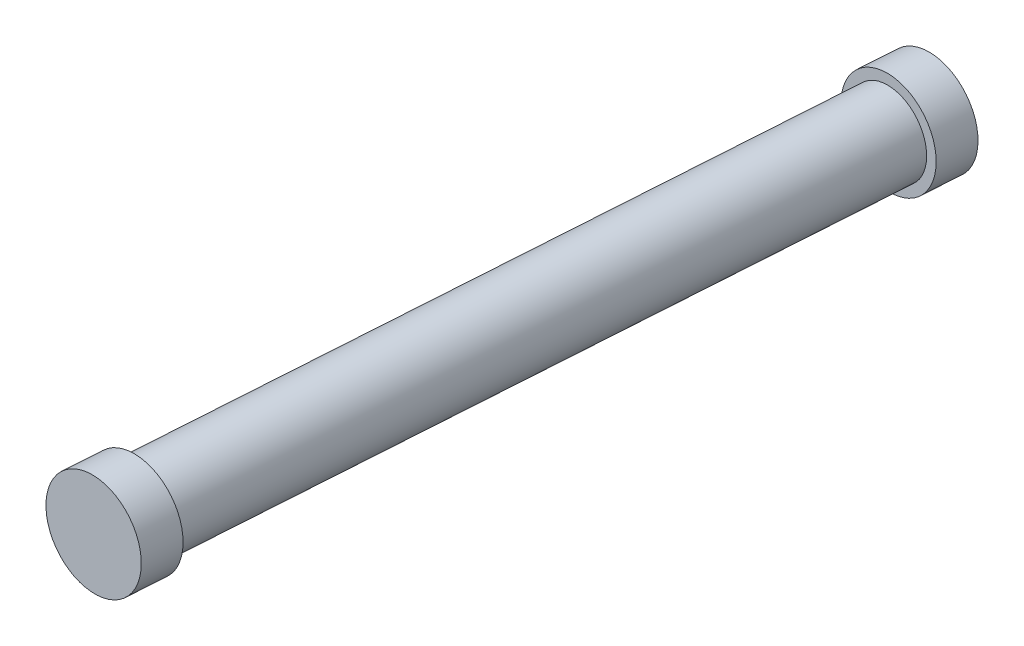
ISO-10303-21;
HEADER;
FILE_DESCRIPTION(('STEP AP214'),'2;1');
FILE_NAME('part.step','',(''),(''),'','','');
FILE_SCHEMA(('AUTOMOTIVE_DESIGN { 1 0 10303 214 1 1 1 1 }'));
ENDSEC;
DATA;
#1=APPLICATION_CONTEXT('core data for automotive mechanical design processes');
#2=APPLICATION_PROTOCOL_DEFINITION('international standard','automotive_design',2000,#1);
#3=PRODUCT_CONTEXT('',#1,'mechanical');
#4=PRODUCT('Part','Part','',(#3));
#5=PRODUCT_RELATED_PRODUCT_CATEGORY('part','',(#4));
#6=PRODUCT_DEFINITION_FORMATION('','',#4);
#7=PRODUCT_DEFINITION_CONTEXT('part definition',#1,'design');
#8=PRODUCT_DEFINITION('design','',#6,#7);
#9=PRODUCT_DEFINITION_SHAPE('','',#8);
#10=(LENGTH_UNIT() NAMED_UNIT(*) SI_UNIT(.MILLI.,.METRE.));
#11=(NAMED_UNIT(*) PLANE_ANGLE_UNIT() SI_UNIT($,.RADIAN.));
#12=(NAMED_UNIT(*) SI_UNIT($,.STERADIAN.) SOLID_ANGLE_UNIT());
#13=UNCERTAINTY_MEASURE_WITH_UNIT(LENGTH_MEASURE(1.E-05),#10,'distance_accuracy_value','');
#14=(GEOMETRIC_REPRESENTATION_CONTEXT(3) GLOBAL_UNCERTAINTY_ASSIGNED_CONTEXT((#13)) GLOBAL_UNIT_ASSIGNED_CONTEXT((#10,
#11,#12)) REPRESENTATION_CONTEXT('',''));
#15=CARTESIAN_POINT('',(0.,0.,0.));
#16=DIRECTION('',(0.,0.,1.));
#17=DIRECTION('',(1.,0.,0.));
#18=AXIS2_PLACEMENT_3D('',#15,#16,#17);
#19=CARTESIAN_POINT('',(1099.8620660427,-65.8785208277451,115.593383200574));
#20=DIRECTION('',(-0.0466405838075336,0.0185987394129378,0.998738575821692));
#21=DIRECTION('',(0.998911359031264,0.,0.0466486526955906));
#22=AXIS2_PLACEMENT_3D('',#19,#20,#21);
#23=CYLINDRICAL_SURFACE('',#22,1.00000000024766);
#24=CARTESIAN_POINT('',(1099.8620660427,-65.8785208277451,115.593383200574));
#25=DIRECTION('',(-0.0466405838075336,0.0185987394129378,0.998738575821692));
#26=DIRECTION('',(0.998911359031264,0.,0.0466486526955906));
#27=AXIS2_PLACEMENT_3D('',#24,#25,#26);
#28=CIRCLE('',#27,1.00000000024766);
#29=CARTESIAN_POINT('',(1100.86097740198,-65.8785208277451,115.640031853281));
#30=VERTEX_POINT('',#29);
#31=EDGE_CURVE('E55',#30,#30,#28,.T.);
#32=ORIENTED_EDGE('',*,*,#31,.T.);
#33=EDGE_LOOP('',(#32));
#34=FACE_BOUND('',#33,.T.);
#35=CARTESIAN_POINT('',(1099.02253553417,-65.5437435183122,133.570677565365));
#36=DIRECTION('',(-0.0466405838075336,0.0185987394129378,0.998738575821692));
#37=DIRECTION('',(0.998911359031264,0.,0.0466486526955906));
#38=AXIS2_PLACEMENT_3D('',#35,#36,#37);
#39=CIRCLE('',#38,1.00000000024766);
#40=CARTESIAN_POINT('',(1100.02144689344,-65.5437435183122,133.617326218072));
#41=VERTEX_POINT('',#40);
#42=EDGE_CURVE('E10',#41,#41,#39,.T.);
#43=ORIENTED_EDGE('',*,*,#42,.F.);
#44=EDGE_LOOP('',(#43));
#45=FACE_BOUND('',#44,.T.);
#46=ADVANCED_FACE('F37',(#34,#45),#23,.T.);
#47=CARTESIAN_POINT('',(1098.97589495036,-65.5251447788993,134.569416141186));
#48=DIRECTION('',(0.0466405838075336,-0.0185987394129379,-0.998738575821692));
#49=DIRECTION('',(-0.998911359031264,0.,-0.0466486526955907));
#50=AXIS2_PLACEMENT_3D('',#47,#48,#49);
#51=CYLINDRICAL_SURFACE('',#50,1.25000000024777);
#52=CARTESIAN_POINT('',(1098.97589495036,-65.5251447788993,134.569416141186));
#53=DIRECTION('',(-0.0466405838075336,0.0185987394129379,0.998738575821692));
#54=DIRECTION('',(0.998911359031264,0.,0.0466486526955907));
#55=AXIS2_PLACEMENT_3D('',#52,#53,#54);
#56=CIRCLE('',#55,1.25000000024777);
#57=CARTESIAN_POINT('',(1100.2245341494,-65.5251447788993,134.627726957068));
#58=VERTEX_POINT('',#57);
#59=EDGE_CURVE('E44',#58,#58,#56,.T.);
#60=ORIENTED_EDGE('',*,*,#59,.F.);
#61=EDGE_LOOP('',(#60));
#62=FACE_BOUND('',#61,.T.);
#63=CARTESIAN_POINT('',(1099.02253553417,-65.5437435183122,133.570677565365));
#64=DIRECTION('',(-0.0466405838075336,0.0185987394129379,0.998738575821692));
#65=DIRECTION('',(0.998911359031264,0.,0.0466486526955907));
#66=AXIS2_PLACEMENT_3D('',#63,#64,#65);
#67=CIRCLE('',#66,1.25000000024777);
#68=CARTESIAN_POINT('',(1100.2711747332,-65.5437435183122,133.628988381246));
#69=VERTEX_POINT('',#68);
#70=EDGE_CURVE('E49',#69,#69,#67,.T.);
#71=ORIENTED_EDGE('',*,*,#70,.T.);
#72=EDGE_LOOP('',(#71));
#73=FACE_BOUND('',#72,.T.);
#74=ADVANCED_FACE('F91',(#62,#73),#51,.T.);
#75=CARTESIAN_POINT('',(1098.97589495036,-65.5251447788993,134.569416141186));
#76=DIRECTION('',(-0.0466405838075336,0.0185987394129379,0.998738575821692));
#77=DIRECTION('',(0.998911359031264,0.,0.0466486526955907));
#78=AXIS2_PLACEMENT_3D('',#75,#76,#77);
#79=PLANE('',#78);
#80=ORIENTED_EDGE('',*,*,#59,.T.);
#81=EDGE_LOOP('',(#80));
#82=FACE_BOUND('',#81,.T.);
#83=ADVANCED_FACE('F86',(#82),#79,.T.);
#84=CARTESIAN_POINT('',(1099.02253553417,-65.5437435183122,133.570677565365));
#85=DIRECTION('',(-0.0466405838075336,0.0185987394129379,0.998738575821692));
#86=DIRECTION('',(0.998911359031264,0.,0.0466486526955907));
#87=AXIS2_PLACEMENT_3D('',#84,#85,#86);
#88=PLANE('',#87);
#89=ORIENTED_EDGE('',*,*,#42,.T.);
#90=EDGE_LOOP('',(#89));
#91=FACE_BOUND('',#90,.T.);
#92=ORIENTED_EDGE('',*,*,#70,.F.);
#93=EDGE_LOOP('',(#92));
#94=FACE_BOUND('',#93,.T.);
#95=ADVANCED_FACE('F78',(#91,#94),#88,.F.);
#96=CARTESIAN_POINT('',(1099.90870662651,-65.8971195671581,114.594644624753));
#97=DIRECTION('',(-0.0466405838075336,0.0185987394129379,0.998738575821692));
#98=DIRECTION('',(0.998911359031264,0.,0.0466486526955907));
#99=AXIS2_PLACEMENT_3D('',#96,#97,#98);
#100=CYLINDRICAL_SURFACE('',#99,1.25000000024777);
#101=CARTESIAN_POINT('',(1099.90870662651,-65.8971195671581,114.594644624753));
#102=DIRECTION('',(-0.0466405838075336,0.0185987394129378,0.998738575821692));
#103=DIRECTION('',(0.998911359031264,0.,0.0466486526955907));
#104=AXIS2_PLACEMENT_3D('',#101,#102,#103);
#105=CIRCLE('',#104,1.25000000024777);
#106=CARTESIAN_POINT('',(1101.15734582555,-65.8971195671581,114.652955440634));
#107=VERTEX_POINT('',#106);
#108=EDGE_CURVE('E62',#107,#107,#105,.T.);
#109=ORIENTED_EDGE('',*,*,#108,.T.);
#110=EDGE_LOOP('',(#109));
#111=FACE_BOUND('',#110,.T.);
#112=CARTESIAN_POINT('',(1099.8620660427,-65.8785208277451,115.593383200574));
#113=DIRECTION('',(-0.0466405838075336,0.0185987394129378,0.998738575821692));
#114=DIRECTION('',(0.998911359031264,0.,0.0466486526955907));
#115=AXIS2_PLACEMENT_3D('',#112,#113,#114);
#116=CIRCLE('',#115,1.25000000024777);
#117=CARTESIAN_POINT('',(1101.11070524174,-65.8785208277451,115.651694016455));
#118=VERTEX_POINT('',#117);
#119=EDGE_CURVE('E58',#118,#118,#116,.T.);
#120=ORIENTED_EDGE('',*,*,#119,.F.);
#121=EDGE_LOOP('',(#120));
#122=FACE_BOUND('',#121,.T.);
#123=ADVANCED_FACE('F75',(#111,#122),#100,.T.);
#124=CARTESIAN_POINT('',(1099.90870662651,-65.8971195671581,114.594644624753));
#125=DIRECTION('',(0.0466405838075336,-0.0185987394129378,-0.998738575821692));
#126=DIRECTION('',(0.998911359031264,0.,0.0466486526955907));
#127=AXIS2_PLACEMENT_3D('',#124,#125,#126);
#128=PLANE('',#127);
#129=ORIENTED_EDGE('',*,*,#108,.F.);
#130=EDGE_LOOP('',(#129));
#131=FACE_BOUND('',#130,.T.);
#132=ADVANCED_FACE('F77',(#131),#128,.T.);
#133=CARTESIAN_POINT('',(1099.8620660427,-65.8785208277451,115.593383200574));
#134=DIRECTION('',(0.0466405838075336,-0.0185987394129378,-0.998738575821692));
#135=DIRECTION('',(0.998911359031264,0.,0.0466486526955907));
#136=AXIS2_PLACEMENT_3D('',#133,#134,#135);
#137=PLANE('',#136);
#138=ORIENTED_EDGE('',*,*,#31,.F.);
#139=EDGE_LOOP('',(#138));
#140=FACE_BOUND('',#139,.T.);
#141=ORIENTED_EDGE('',*,*,#119,.T.);
#142=EDGE_LOOP('',(#141));
#143=FACE_BOUND('',#142,.T.);
#144=ADVANCED_FACE('F73',(#140,#143),#137,.F.);
#145=CLOSED_SHELL('',(#46,#74,#83,#95,#123,#132,#144));
#146=MANIFOLD_SOLID_BREP('B2',#145);
#147=ADVANCED_BREP_SHAPE_REPRESENTATION('',(#18,#146),#14);
#148=SHAPE_DEFINITION_REPRESENTATION(#9,#147);
ENDSEC;
END-ISO-10303-21;
